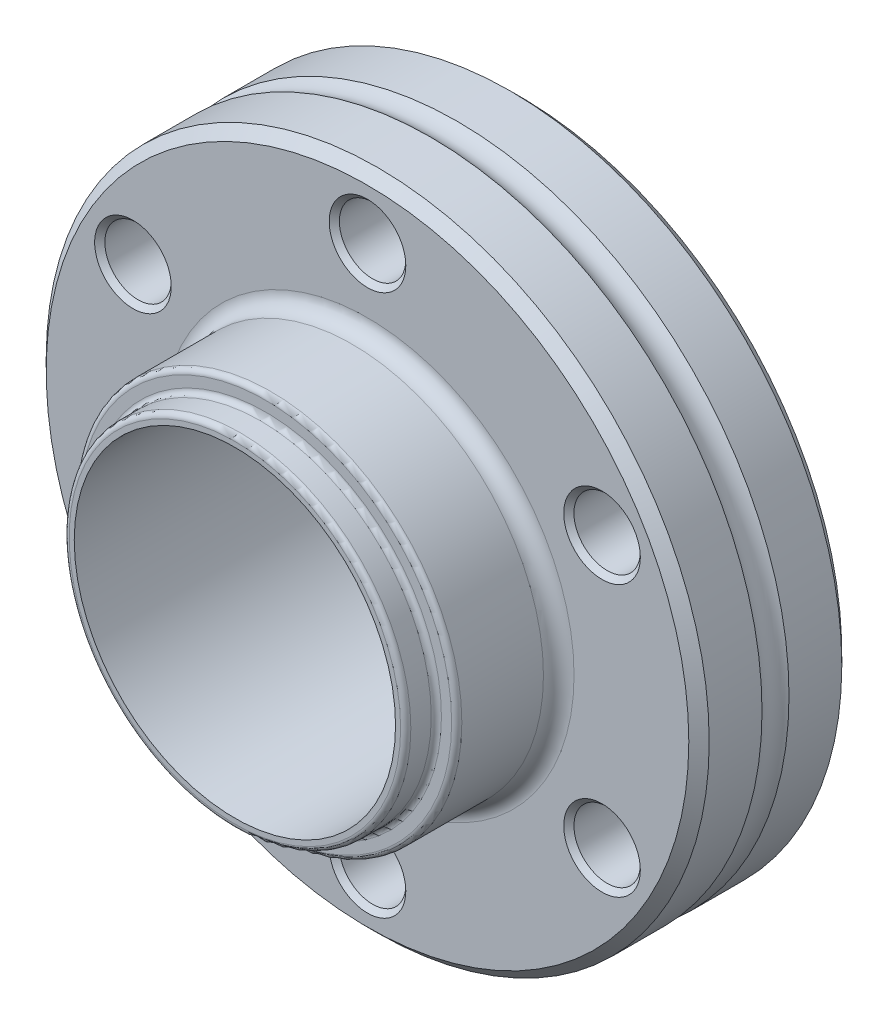
ISO-10303-21;
HEADER;
FILE_DESCRIPTION(('STEP AP214'),'2;1');
FILE_NAME('part.step','',(''),(''),'','','');
FILE_SCHEMA(('AUTOMOTIVE_DESIGN { 1 0 10303 214 1 1 1 1 }'));
ENDSEC;
DATA;
#1=APPLICATION_CONTEXT('core data for automotive mechanical design processes');
#2=APPLICATION_PROTOCOL_DEFINITION('international standard','automotive_design',2000,#1);
#3=PRODUCT_CONTEXT('',#1,'mechanical');
#4=PRODUCT('Part','Part','',(#3));
#5=PRODUCT_RELATED_PRODUCT_CATEGORY('part','',(#4));
#6=PRODUCT_DEFINITION_FORMATION('','',#4);
#7=PRODUCT_DEFINITION_CONTEXT('part definition',#1,'design');
#8=PRODUCT_DEFINITION('design','',#6,#7);
#9=PRODUCT_DEFINITION_SHAPE('','',#8);
#10=(LENGTH_UNIT() NAMED_UNIT(*) SI_UNIT(.MILLI.,.METRE.));
#11=(NAMED_UNIT(*) PLANE_ANGLE_UNIT() SI_UNIT($,.RADIAN.));
#12=(NAMED_UNIT(*) SI_UNIT($,.STERADIAN.) SOLID_ANGLE_UNIT());
#13=UNCERTAINTY_MEASURE_WITH_UNIT(LENGTH_MEASURE(1.E-05),#10,'distance_accuracy_value','');
#14=(GEOMETRIC_REPRESENTATION_CONTEXT(3) GLOBAL_UNCERTAINTY_ASSIGNED_CONTEXT((#13)) GLOBAL_UNIT_ASSIGNED_CONTEXT((#10,
#11,#12)) REPRESENTATION_CONTEXT('',''));
#15=CARTESIAN_POINT('',(0.,0.,0.));
#16=DIRECTION('',(0.,0.,1.));
#17=DIRECTION('',(1.,0.,0.));
#18=AXIS2_PLACEMENT_3D('',#15,#16,#17);
#19=CARTESIAN_POINT('',(0.,0.,-6.4516));
#20=DIRECTION('',(0.,0.,-1.));
#21=DIRECTION('',(-1.,0.,0.));
#22=AXIS2_PLACEMENT_3D('',#19,#20,#21);
#23=CONICAL_SURFACE('',#22,9.271,0.349065850398823);
#24=CARTESIAN_POINT('',(0.,0.,-5.94360000000001));
#25=DIRECTION('',(0.,0.,1.));
#26=DIRECTION('',(1.,0.,0.));
#27=AXIS2_PLACEMENT_3D('',#24,#25,#26);
#28=CIRCLE('',#27,9.0861031209928);
#29=CARTESIAN_POINT('',(9.0861031209928,0.,-5.94360000000001));
#30=VERTEX_POINT('',#29);
#31=EDGE_CURVE('E167',#30,#30,#28,.T.);
#32=ORIENTED_EDGE('',*,*,#31,.T.);
#33=EDGE_LOOP('',(#32));
#34=FACE_BOUND('',#33,.T.);
#35=CARTESIAN_POINT('',(0.,0.,-6.4516));
#36=DIRECTION('',(0.,0.,1.));
#37=DIRECTION('',(1.,0.,0.));
#38=AXIS2_PLACEMENT_3D('',#35,#36,#37);
#39=CIRCLE('',#38,9.271);
#40=CARTESIAN_POINT('',(9.271,0.,-6.4516));
#41=VERTEX_POINT('',#40);
#42=EDGE_CURVE('E152',#41,#41,#39,.T.);
#43=ORIENTED_EDGE('',*,*,#42,.F.);
#44=EDGE_LOOP('',(#43));
#45=FACE_BOUND('',#44,.T.);
#46=ADVANCED_FACE('F30',(#34,#45),#23,.F.);
#47=CARTESIAN_POINT('',(0.,0.,-5.92002147285428));
#48=DIRECTION('',(0.,0.,1.));
#49=DIRECTION('',(1.,0.,0.));
#50=AXIS2_PLACEMENT_3D('',#47,#48,#49);
#51=CONICAL_SURFACE('',#50,10.7315,1.22173047639607);
#52=ORIENTED_EDGE('',*,*,#42,.T.);
#53=EDGE_LOOP('',(#52));
#54=FACE_BOUND('',#53,.T.);
#55=CARTESIAN_POINT('',(0.,0.,-5.92002147285428));
#56=DIRECTION('',(0.,0.,1.));
#57=DIRECTION('',(1.,0.,0.));
#58=AXIS2_PLACEMENT_3D('',#55,#56,#57);
#59=CIRCLE('',#58,10.7315);
#60=CARTESIAN_POINT('',(10.7315,0.,-5.92002147285428));
#61=VERTEX_POINT('',#60);
#62=EDGE_CURVE('E155',#61,#61,#59,.T.);
#63=ORIENTED_EDGE('',*,*,#62,.F.);
#64=EDGE_LOOP('',(#63));
#65=FACE_BOUND('',#64,.T.);
#66=ADVANCED_FACE('F192',(#54,#65),#51,.T.);
#67=CARTESIAN_POINT('',(0.,0.,-7.112));
#68=DIRECTION('',(0.,0.,1.));
#69=DIRECTION('',(1.,0.,0.));
#70=AXIS2_PLACEMENT_3D('',#67,#68,#69);
#71=CYLINDRICAL_SURFACE('',#70,10.7315);
#72=ORIENTED_EDGE('',*,*,#62,.T.);
#73=EDGE_LOOP('',(#72));
#74=FACE_BOUND('',#73,.T.);
#75=CARTESIAN_POINT('',(0.,0.,-7.112));
#76=DIRECTION('',(0.,0.,1.));
#77=DIRECTION('',(1.,0.,0.));
#78=AXIS2_PLACEMENT_3D('',#75,#76,#77);
#79=CIRCLE('',#78,10.7315);
#80=CARTESIAN_POINT('',(10.7315,0.,-7.112));
#81=VERTEX_POINT('',#80);
#82=EDGE_CURVE('E158',#81,#81,#79,.T.);
#83=ORIENTED_EDGE('',*,*,#82,.F.);
#84=EDGE_LOOP('',(#83));
#85=FACE_BOUND('',#84,.T.);
#86=ADVANCED_FACE('F198',(#74,#85),#71,.F.);
#87=CARTESIAN_POINT('',(16.51,0.,-7.112));
#88=DIRECTION('',(0.,0.,-1.));
#89=DIRECTION('',(-1.,0.,0.));
#90=AXIS2_PLACEMENT_3D('',#87,#88,#89);
#91=PLANE('',#90);
#92=CARTESIAN_POINT('',(0.,0.,-7.112));
#93=DIRECTION('',(0.,0.,-1.));
#94=DIRECTION('',(-1.,0.,0.));
#95=AXIS2_PLACEMENT_3D('',#92,#93,#94);
#96=CIRCLE('',#95,16.002);
#97=CARTESIAN_POINT('',(-16.002,0.,-7.112));
#98=VERTEX_POINT('',#97);
#99=EDGE_CURVE('E74',#98,#98,#96,.T.);
#100=ORIENTED_EDGE('',*,*,#99,.T.);
#101=EDGE_LOOP('',(#100));
#102=FACE_BOUND('',#101,.T.);
#103=CARTESIAN_POINT('',(11.6804310310022,-6.74370000000002,-7.11200000000006));
#104=DIRECTION('',(0.,0.,-1.));
#105=DIRECTION('',(-1.,0.,0.));
#106=AXIS2_PLACEMENT_3D('',#103,#104,#105);
#107=CIRCLE('',#106,1.90754000009767);
#108=CARTESIAN_POINT('',(9.77289103090454,-6.74370000000002,-7.11200000000006));
#109=VERTEX_POINT('',#108);
#110=EDGE_CURVE('E134',#109,#109,#107,.F.);
#111=ORIENTED_EDGE('',*,*,#110,.T.);
#112=EDGE_LOOP('',(#111));
#113=FACE_BOUND('',#112,.T.);
#114=CARTESIAN_POINT('',(0.,-13.4874,-7.112));
#115=DIRECTION('',(0.,0.,-1.));
#116=DIRECTION('',(-1.,0.,0.));
#117=AXIS2_PLACEMENT_3D('',#114,#115,#116);
#118=CIRCLE('',#117,1.90754000009767);
#119=CARTESIAN_POINT('',(-1.90754000009767,-13.4874,-7.112));
#120=VERTEX_POINT('',#119);
#121=EDGE_CURVE('E137',#120,#120,#118,.F.);
#122=ORIENTED_EDGE('',*,*,#121,.T.);
#123=EDGE_LOOP('',(#122));
#124=FACE_BOUND('',#123,.T.);
#125=CARTESIAN_POINT('',(11.6804310310022,6.74369999999999,-7.112));
#126=DIRECTION('',(0.,0.,-1.));
#127=DIRECTION('',(-1.,0.,0.));
#128=AXIS2_PLACEMENT_3D('',#125,#126,#127);
#129=CIRCLE('',#128,1.90754000009767);
#130=CARTESIAN_POINT('',(9.77289103090454,6.74369999999999,-7.112));
#131=VERTEX_POINT('',#130);
#132=EDGE_CURVE('E140',#131,#131,#129,.F.);
#133=ORIENTED_EDGE('',*,*,#132,.T.);
#134=EDGE_LOOP('',(#133));
#135=FACE_BOUND('',#134,.T.);
#136=CARTESIAN_POINT('',(-11.6804310310022,-6.7437,-7.112));
#137=DIRECTION('',(0.,0.,-1.));
#138=DIRECTION('',(-1.,0.,0.));
#139=AXIS2_PLACEMENT_3D('',#136,#137,#138);
#140=CIRCLE('',#139,1.90754000009767);
#141=CARTESIAN_POINT('',(-13.5879710310999,-6.7437,-7.112));
#142=VERTEX_POINT('',#141);
#143=EDGE_CURVE('E143',#142,#142,#140,.F.);
#144=ORIENTED_EDGE('',*,*,#143,.T.);
#145=EDGE_LOOP('',(#144));
#146=FACE_BOUND('',#145,.T.);
#147=CARTESIAN_POINT('',(0.,13.4874,-7.112));
#148=DIRECTION('',(0.,0.,-1.));
#149=DIRECTION('',(-1.,0.,0.));
#150=AXIS2_PLACEMENT_3D('',#147,#148,#149);
#151=CIRCLE('',#150,1.90754000009767);
#152=CARTESIAN_POINT('',(-1.90754000009767,13.4874,-7.112));
#153=VERTEX_POINT('',#152);
#154=EDGE_CURVE('E146',#153,#153,#151,.F.);
#155=ORIENTED_EDGE('',*,*,#154,.T.);
#156=EDGE_LOOP('',(#155));
#157=FACE_BOUND('',#156,.T.);
#158=CARTESIAN_POINT('',(-11.6804310310022,6.7437,-7.11199999999994));
#159=DIRECTION('',(0.,0.,-1.));
#160=DIRECTION('',(-1.,0.,0.));
#161=AXIS2_PLACEMENT_3D('',#158,#159,#160);
#162=CIRCLE('',#161,1.90754000009767);
#163=CARTESIAN_POINT('',(-13.5879710310999,6.7437,-7.11199999999994));
#164=VERTEX_POINT('',#163);
#165=EDGE_CURVE('E149',#164,#164,#162,.F.);
#166=ORIENTED_EDGE('',*,*,#165,.T.);
#167=EDGE_LOOP('',(#166));
#168=FACE_BOUND('',#167,.T.);
#169=ORIENTED_EDGE('',*,*,#82,.T.);
#170=EDGE_LOOP('',(#169));
#171=FACE_BOUND('',#170,.T.);
#172=ADVANCED_FACE('F309',(#102,#113,#124,#135,#146,#157,#168,#171),#91,.T.);
#173=CARTESIAN_POINT('',(0.,0.,-7.112));
#174=DIRECTION('',(0.,0.,1.));
#175=DIRECTION('',(1.,0.,0.));
#176=AXIS2_PLACEMENT_3D('',#173,#174,#175);
#177=CYLINDRICAL_SURFACE('',#176,16.51);
#178=CARTESIAN_POINT('',(0.,0.,-6.60399999999999));
#179=DIRECTION('',(0.,0.,-1.));
#180=DIRECTION('',(-1.,0.,0.));
#181=AXIS2_PLACEMENT_3D('',#178,#179,#180);
#182=CIRCLE('',#181,16.51);
#183=CARTESIAN_POINT('',(-16.51,0.,-6.60399999999999));
#184=VERTEX_POINT('',#183);
#185=EDGE_CURVE('E77',#184,#184,#182,.F.);
#186=ORIENTED_EDGE('',*,*,#185,.T.);
#187=EDGE_LOOP('',(#186));
#188=FACE_BOUND('',#187,.T.);
#189=CARTESIAN_POINT('',(0.,0.,-3.97402083301042));
#190=DIRECTION('',(0.,0.,1.));
#191=DIRECTION('',(1.,0.,0.));
#192=AXIS2_PLACEMENT_3D('',#189,#190,#191);
#193=CIRCLE('',#192,16.51);
#194=CARTESIAN_POINT('',(16.51,0.,-3.97402083301042));
#195=VERTEX_POINT('',#194);
#196=EDGE_CURVE('E161',#195,#195,#193,.T.);
#197=ORIENTED_EDGE('',*,*,#196,.F.);
#198=EDGE_LOOP('',(#197));
#199=FACE_BOUND('',#198,.T.);
#200=ADVANCED_FACE('F305',(#188,#199),#177,.T.);
#201=CARTESIAN_POINT('',(0.,0.,-3.302));
#202=DIRECTION('',(0.,0.,1.));
#203=DIRECTION('',(1.,0.,0.));
#204=AXIS2_PLACEMENT_3D('',#201,#202,#203);
#205=TOROIDAL_SURFACE('',#204,17.272,1.016);
#206=ORIENTED_EDGE('',*,*,#196,.T.);
#207=EDGE_LOOP('',(#206));
#208=FACE_BOUND('',#207,.T.);
#209=CARTESIAN_POINT('',(0.,0.,-2.62997916698959));
#210=DIRECTION('',(0.,0.,1.));
#211=DIRECTION('',(1.,0.,0.));
#212=AXIS2_PLACEMENT_3D('',#209,#210,#211);
#213=CIRCLE('',#212,16.51);
#214=CARTESIAN_POINT('',(16.51,0.,-2.62997916698959));
#215=VERTEX_POINT('',#214);
#216=EDGE_CURVE('E164',#215,#215,#213,.T.);
#217=ORIENTED_EDGE('',*,*,#216,.F.);
#218=EDGE_LOOP('',(#217));
#219=FACE_BOUND('',#218,.T.);
#220=ADVANCED_FACE('F301',(#208,#219),#205,.F.);
#221=CARTESIAN_POINT('',(0.,0.,-7.112));
#222=DIRECTION('',(0.,0.,1.));
#223=DIRECTION('',(1.,0.,0.));
#224=AXIS2_PLACEMENT_3D('',#221,#222,#223);
#225=CYLINDRICAL_SURFACE('',#224,16.51);
#226=CARTESIAN_POINT('',(0.,0.,0.));
#227=DIRECTION('',(0.,0.,1.));
#228=DIRECTION('',(1.,0.,0.));
#229=AXIS2_PLACEMENT_3D('',#226,#227,#228);
#230=CIRCLE('',#229,16.51);
#231=CARTESIAN_POINT('',(16.51,0.,0.));
#232=VERTEX_POINT('',#231);
#233=EDGE_CURVE('E68',#232,#232,#230,.F.);
#234=ORIENTED_EDGE('',*,*,#233,.T.);
#235=EDGE_LOOP('',(#234));
#236=FACE_BOUND('',#235,.T.);
#237=ORIENTED_EDGE('',*,*,#216,.T.);
#238=EDGE_LOOP('',(#237));
#239=FACE_BOUND('',#238,.T.);
#240=ADVANCED_FACE('F295',(#236,#239),#225,.T.);
#241=CARTESIAN_POINT('',(0.,0.,0.508000000000002));
#242=DIRECTION('',(0.,0.,1.));
#243=DIRECTION('',(1.,0.,0.));
#244=AXIS2_PLACEMENT_3D('',#241,#242,#243);
#245=PLANE('',#244);
#246=CARTESIAN_POINT('',(0.,0.,0.508000000000002));
#247=DIRECTION('',(0.,0.,1.));
#248=DIRECTION('',(1.,0.,0.));
#249=AXIS2_PLACEMENT_3D('',#246,#247,#248);
#250=CIRCLE('',#249,10.287);
#251=CARTESIAN_POINT('',(10.287,0.,0.508000000000002));
#252=VERTEX_POINT('',#251);
#253=EDGE_CURVE('E10',#252,#252,#250,.F.);
#254=ORIENTED_EDGE('',*,*,#253,.T.);
#255=EDGE_LOOP('',(#254));
#256=FACE_BOUND('',#255,.T.);
#257=CARTESIAN_POINT('',(0.,0.,0.508000000000002));
#258=DIRECTION('',(0.,0.,1.));
#259=DIRECTION('',(1.,0.,0.));
#260=AXIS2_PLACEMENT_3D('',#257,#258,#259);
#261=CIRCLE('',#260,16.002);
#262=CARTESIAN_POINT('',(16.002,0.,0.508000000000002));
#263=VERTEX_POINT('',#262);
#264=EDGE_CURVE('E71',#263,#263,#261,.T.);
#265=ORIENTED_EDGE('',*,*,#264,.T.);
#266=EDGE_LOOP('',(#265));
#267=FACE_BOUND('',#266,.T.);
#268=CARTESIAN_POINT('',(0.,-13.4874,0.508000000000002));
#269=DIRECTION('',(0.,0.,1.));
#270=DIRECTION('',(1.,0.,0.));
#271=AXIS2_PLACEMENT_3D('',#268,#269,#270);
#272=CIRCLE('',#271,1.90754000009768);
#273=CARTESIAN_POINT('',(1.90754000009768,-13.4874,0.508000000000002));
#274=VERTEX_POINT('',#273);
#275=EDGE_CURVE('E104',#274,#274,#272,.F.);
#276=ORIENTED_EDGE('',*,*,#275,.T.);
#277=EDGE_LOOP('',(#276));
#278=FACE_BOUND('',#277,.T.);
#279=CARTESIAN_POINT('',(-11.6804310310022,6.7437,0.508000000000057));
#280=DIRECTION('',(0.,0.,1.));
#281=DIRECTION('',(1.,0.,0.));
#282=AXIS2_PLACEMENT_3D('',#279,#280,#281);
#283=CIRCLE('',#282,1.90754000009767);
#284=CARTESIAN_POINT('',(-9.77289103090455,6.7437,0.508000000000057));
#285=VERTEX_POINT('',#284);
#286=EDGE_CURVE('E107',#285,#285,#283,.F.);
#287=ORIENTED_EDGE('',*,*,#286,.T.);
#288=EDGE_LOOP('',(#287));
#289=FACE_BOUND('',#288,.T.);
#290=CARTESIAN_POINT('',(11.6804310310022,6.74369999999999,0.508000000000002));
#291=DIRECTION('',(0.,0.,1.));
#292=DIRECTION('',(1.,0.,0.));
#293=AXIS2_PLACEMENT_3D('',#290,#291,#292);
#294=CIRCLE('',#293,1.90754000009767);
#295=CARTESIAN_POINT('',(13.5879710310999,6.74369999999999,0.508000000000002));
#296=VERTEX_POINT('',#295);
#297=EDGE_CURVE('E110',#296,#296,#294,.F.);
#298=ORIENTED_EDGE('',*,*,#297,.T.);
#299=EDGE_LOOP('',(#298));
#300=FACE_BOUND('',#299,.T.);
#301=CARTESIAN_POINT('',(0.,13.4874,0.508000000000002));
#302=DIRECTION('',(0.,0.,1.));
#303=DIRECTION('',(1.,0.,0.));
#304=AXIS2_PLACEMENT_3D('',#301,#302,#303);
#305=CIRCLE('',#304,1.90754000009768);
#306=CARTESIAN_POINT('',(1.90754000009768,13.4874,0.508000000000002));
#307=VERTEX_POINT('',#306);
#308=EDGE_CURVE('E113',#307,#307,#305,.F.);
#309=ORIENTED_EDGE('',*,*,#308,.T.);
#310=EDGE_LOOP('',(#309));
#311=FACE_BOUND('',#310,.T.);
#312=CARTESIAN_POINT('',(-11.6804310310022,-6.7437,0.507999999999995));
#313=DIRECTION('',(0.,0.,1.));
#314=DIRECTION('',(1.,0.,0.));
#315=AXIS2_PLACEMENT_3D('',#312,#313,#314);
#316=CIRCLE('',#315,1.90754000009767);
#317=CARTESIAN_POINT('',(-9.77289103090453,-6.7437,0.507999999999995));
#318=VERTEX_POINT('',#317);
#319=EDGE_CURVE('E116',#318,#318,#316,.F.);
#320=ORIENTED_EDGE('',*,*,#319,.T.);
#321=EDGE_LOOP('',(#320));
#322=FACE_BOUND('',#321,.T.);
#323=CARTESIAN_POINT('',(11.6804310310022,-6.7437,0.507999999999939));
#324=DIRECTION('',(0.,0.,1.));
#325=DIRECTION('',(1.,0.,0.));
#326=AXIS2_PLACEMENT_3D('',#323,#324,#325);
#327=CIRCLE('',#326,1.90754000009767);
#328=CARTESIAN_POINT('',(13.5879710310999,-6.7437,0.507999999999939));
#329=VERTEX_POINT('',#328);
#330=EDGE_CURVE('E119',#329,#329,#327,.F.);
#331=ORIENTED_EDGE('',*,*,#330,.T.);
#332=EDGE_LOOP('',(#331));
#333=FACE_BOUND('',#332,.T.);
#334=ADVANCED_FACE('F287',(#256,#267,#278,#289,#300,#311,#322,#333),#245,.T.);
#335=CARTESIAN_POINT('',(9.0861031209928,0.,-5.94360000000001));
#336=DIRECTION('',(0.,0.,-1.));
#337=DIRECTION('',(-1.,0.,0.));
#338=AXIS2_PLACEMENT_3D('',#335,#336,#337);
#339=PLANE('',#338);
#340=CARTESIAN_POINT('',(0.,0.,-5.94360000000001));
#341=DIRECTION('',(0.,0.,-1.));
#342=DIRECTION('',(-1.,0.,0.));
#343=AXIS2_PLACEMENT_3D('',#340,#341,#342);
#344=CIRCLE('',#343,8.25500000000001);
#345=CARTESIAN_POINT('',(-8.25500000000001,0.,-5.94360000000001));
#346=VERTEX_POINT('',#345);
#347=EDGE_CURVE('E41',#346,#346,#344,.F.);
#348=ORIENTED_EDGE('',*,*,#347,.T.);
#349=EDGE_LOOP('',(#348));
#350=FACE_BOUND('',#349,.T.);
#351=ORIENTED_EDGE('',*,*,#31,.F.);
#352=EDGE_LOOP('',(#351));
#353=FACE_BOUND('',#352,.T.);
#354=ADVANCED_FACE('F283',(#350,#353),#339,.T.);
#355=CARTESIAN_POINT('',(0.,0.,5.58800000000001));
#356=DIRECTION('',(0.,0.,-1.));
#357=DIRECTION('',(-1.,0.,0.));
#358=AXIS2_PLACEMENT_3D('',#355,#356,#357);
#359=CYLINDRICAL_SURFACE('',#358,9.52499999999999);
#360=CARTESIAN_POINT('',(0.,0.,1.27));
#361=DIRECTION('',(0.,0.,1.));
#362=DIRECTION('',(1.,0.,0.));
#363=AXIS2_PLACEMENT_3D('',#360,#361,#362);
#364=CIRCLE('',#363,9.52499999999999);
#365=CARTESIAN_POINT('',(9.52499999999999,0.,1.27));
#366=VERTEX_POINT('',#365);
#367=EDGE_CURVE('E37',#366,#366,#364,.T.);
#368=ORIENTED_EDGE('',*,*,#367,.T.);
#369=EDGE_LOOP('',(#368));
#370=FACE_BOUND('',#369,.T.);
#371=CARTESIAN_POINT('',(0.,0.,5.33400000000001));
#372=DIRECTION('',(0.,0.,1.));
#373=DIRECTION('',(1.,0.,0.));
#374=AXIS2_PLACEMENT_3D('',#371,#372,#373);
#375=CIRCLE('',#374,9.52499999999999);
#376=CARTESIAN_POINT('',(9.52499999999999,0.,5.33400000000001));
#377=VERTEX_POINT('',#376);
#378=EDGE_CURVE('E59',#377,#377,#375,.F.);
#379=ORIENTED_EDGE('',*,*,#378,.T.);
#380=EDGE_LOOP('',(#379));
#381=FACE_BOUND('',#380,.T.);
#382=ADVANCED_FACE('F286',(#370,#381),#359,.T.);
#383=CARTESIAN_POINT('',(0.,0.,5.58800000000001));
#384=DIRECTION('',(0.,0.,1.));
#385=DIRECTION('',(1.,0.,0.));
#386=AXIS2_PLACEMENT_3D('',#383,#384,#385);
#387=PLANE('',#386);
#388=CARTESIAN_POINT('',(0.,0.,5.58800000000001));
#389=DIRECTION('',(0.,0.,1.));
#390=DIRECTION('',(1.,0.,0.));
#391=AXIS2_PLACEMENT_3D('',#388,#389,#390);
#392=CIRCLE('',#391,9.27099999999999);
#393=CARTESIAN_POINT('',(9.27099999999999,0.,5.58800000000001));
#394=VERTEX_POINT('',#393);
#395=EDGE_CURVE('E62',#394,#394,#392,.T.);
#396=ORIENTED_EDGE('',*,*,#395,.T.);
#397=EDGE_LOOP('',(#396));
#398=FACE_BOUND('',#397,.T.);
#399=CARTESIAN_POINT('',(0.,0.,5.58800000000001));
#400=DIRECTION('',(0.,0.,1.));
#401=DIRECTION('',(1.,0.,0.));
#402=AXIS2_PLACEMENT_3D('',#399,#400,#401);
#403=CIRCLE('',#402,8.76299999999999);
#404=CARTESIAN_POINT('',(8.76299999999999,0.,5.58800000000001));
#405=VERTEX_POINT('',#404);
#406=EDGE_CURVE('E65',#405,#405,#403,.F.);
#407=ORIENTED_EDGE('',*,*,#406,.T.);
#408=EDGE_LOOP('',(#407));
#409=FACE_BOUND('',#408,.T.);
#410=ADVANCED_FACE('F188',(#398,#409),#387,.T.);
#411=CARTESIAN_POINT('',(0.,0.,7.112));
#412=DIRECTION('',(0.,0.,-1.));
#413=DIRECTION('',(-1.,0.,0.));
#414=AXIS2_PLACEMENT_3D('',#411,#412,#413);
#415=CYLINDRICAL_SURFACE('',#414,8.50899999999999);
#416=CARTESIAN_POINT('',(0.,0.,5.84200000000001));
#417=DIRECTION('',(0.,0.,1.));
#418=DIRECTION('',(1.,0.,0.));
#419=AXIS2_PLACEMENT_3D('',#416,#417,#418);
#420=CIRCLE('',#419,8.50899999999999);
#421=CARTESIAN_POINT('',(8.50899999999999,0.,5.84200000000001));
#422=VERTEX_POINT('',#421);
#423=EDGE_CURVE('E53',#422,#422,#420,.T.);
#424=ORIENTED_EDGE('',*,*,#423,.T.);
#425=EDGE_LOOP('',(#424));
#426=FACE_BOUND('',#425,.T.);
#427=CARTESIAN_POINT('',(0.,0.,6.858));
#428=DIRECTION('',(0.,0.,1.));
#429=DIRECTION('',(1.,0.,0.));
#430=AXIS2_PLACEMENT_3D('',#427,#428,#429);
#431=CIRCLE('',#430,8.50899999999999);
#432=CARTESIAN_POINT('',(8.50899999999999,0.,6.858));
#433=VERTEX_POINT('',#432);
#434=EDGE_CURVE('E56',#433,#433,#431,.F.);
#435=ORIENTED_EDGE('',*,*,#434,.T.);
#436=EDGE_LOOP('',(#435));
#437=FACE_BOUND('',#436,.T.);
#438=ADVANCED_FACE('F178',(#426,#437),#415,.T.);
#439=CARTESIAN_POINT('',(0.,0.,7.112));
#440=DIRECTION('',(0.,0.,1.));
#441=DIRECTION('',(1.,0.,0.));
#442=AXIS2_PLACEMENT_3D('',#439,#440,#441);
#443=PLANE('',#442);
#444=CARTESIAN_POINT('',(0.,0.,7.112));
#445=DIRECTION('',(0.,0.,1.));
#446=DIRECTION('',(1.,0.,0.));
#447=AXIS2_PLACEMENT_3D('',#444,#445,#446);
#448=CIRCLE('',#447,8.25499999999999);
#449=CARTESIAN_POINT('',(8.25499999999999,0.,7.112));
#450=VERTEX_POINT('',#449);
#451=EDGE_CURVE('E50',#450,#450,#448,.T.);
#452=ORIENTED_EDGE('',*,*,#451,.T.);
#453=EDGE_LOOP('',(#452));
#454=FACE_BOUND('',#453,.T.);
#455=CARTESIAN_POINT('',(0.,0.,7.112));
#456=DIRECTION('',(0.,0.,1.));
#457=DIRECTION('',(1.,0.,0.));
#458=AXIS2_PLACEMENT_3D('',#455,#456,#457);
#459=CIRCLE('',#458,8.00100000000001);
#460=CARTESIAN_POINT('',(8.00100000000001,0.,7.112));
#461=VERTEX_POINT('',#460);
#462=EDGE_CURVE('E170',#461,#461,#459,.T.);
#463=ORIENTED_EDGE('',*,*,#462,.F.);
#464=EDGE_LOOP('',(#463));
#465=FACE_BOUND('',#464,.T.);
#466=ADVANCED_FACE('F176',(#454,#465),#443,.T.);
#467=CARTESIAN_POINT('',(0.,0.,7.112));
#468=DIRECTION('',(0.,0.,1.));
#469=DIRECTION('',(1.,0.,0.));
#470=AXIS2_PLACEMENT_3D('',#467,#468,#469);
#471=CYLINDRICAL_SURFACE('',#470,8.00100000000001);
#472=CARTESIAN_POINT('',(0.,0.,-5.68960000000001));
#473=DIRECTION('',(0.,0.,-1.));
#474=DIRECTION('',(-1.,0.,0.));
#475=AXIS2_PLACEMENT_3D('',#472,#473,#474);
#476=CIRCLE('',#475,8.00100000000001);
#477=CARTESIAN_POINT('',(-8.00100000000001,0.,-5.68960000000001));
#478=VERTEX_POINT('',#477);
#479=EDGE_CURVE('E45',#478,#478,#476,.T.);
#480=ORIENTED_EDGE('',*,*,#479,.T.);
#481=EDGE_LOOP('',(#480));
#482=FACE_BOUND('',#481,.T.);
#483=ORIENTED_EDGE('',*,*,#462,.T.);
#484=EDGE_LOOP('',(#483));
#485=FACE_BOUND('',#484,.T.);
#486=ADVANCED_FACE('F174',(#482,#485),#471,.F.);
#487=CARTESIAN_POINT('',(11.6804310310022,-6.7437,0.507999999999939));
#488=DIRECTION('',(0.,0.,1.));
#489=DIRECTION('',(1.,0.,0.));
#490=AXIS2_PLACEMENT_3D('',#487,#488,#489);
#491=CYLINDRICAL_SURFACE('',#490,1.65353999999999);
#492=CARTESIAN_POINT('',(11.6804310310022,-6.74370000000001,-6.85799999990238));
#493=DIRECTION('',(0.,0.,-1.));
#494=DIRECTION('',(-1.,0.,0.));
#495=AXIS2_PLACEMENT_3D('',#492,#493,#494);
#496=CIRCLE('',#495,1.65353999999999);
#497=CARTESIAN_POINT('',(10.0268910310022,-6.74370000000001,-6.85799999990238));
#498=VERTEX_POINT('',#497);
#499=EDGE_CURVE('E128',#498,#498,#496,.T.);
#500=ORIENTED_EDGE('',*,*,#499,.T.);
#501=EDGE_LOOP('',(#500));
#502=FACE_BOUND('',#501,.T.);
#503=CARTESIAN_POINT('',(11.6804310310022,-6.7437,0.253999999902263));
#504=DIRECTION('',(0.,0.,1.));
#505=DIRECTION('',(1.,0.,0.));
#506=AXIS2_PLACEMENT_3D('',#503,#504,#505);
#507=CIRCLE('',#506,1.65353999999999);
#508=CARTESIAN_POINT('',(13.3339710310022,-6.7437,0.253999999902263));
#509=VERTEX_POINT('',#508);
#510=EDGE_CURVE('E131',#509,#509,#507,.T.);
#511=ORIENTED_EDGE('',*,*,#510,.T.);
#512=EDGE_LOOP('',(#511));
#513=FACE_BOUND('',#512,.T.);
#514=ADVANCED_FACE('F185',(#502,#513),#491,.F.);
#515=CARTESIAN_POINT('',(11.6804310310022,6.74369999999999,-7.112));
#516=DIRECTION('',(0.,0.,-1.));
#517=DIRECTION('',(-1.,0.,0.));
#518=AXIS2_PLACEMENT_3D('',#515,#516,#517);
#519=CYLINDRICAL_SURFACE('',#518,1.65353999999999);
#520=CARTESIAN_POINT('',(11.6804310310022,6.74369999999999,0.253999999902318));
#521=DIRECTION('',(0.,0.,1.));
#522=DIRECTION('',(1.,0.,0.));
#523=AXIS2_PLACEMENT_3D('',#520,#521,#522);
#524=CIRCLE('',#523,1.65353999999999);
#525=CARTESIAN_POINT('',(13.3339710310022,6.74369999999999,0.253999999902318));
#526=VERTEX_POINT('',#525);
#527=EDGE_CURVE('E92',#526,#526,#524,.T.);
#528=ORIENTED_EDGE('',*,*,#527,.T.);
#529=EDGE_LOOP('',(#528));
#530=FACE_BOUND('',#529,.T.);
#531=CARTESIAN_POINT('',(11.6804310310022,6.74369999999999,-6.85799999990232));
#532=DIRECTION('',(0.,0.,-1.));
#533=DIRECTION('',(-1.,0.,0.));
#534=AXIS2_PLACEMENT_3D('',#531,#532,#533);
#535=CIRCLE('',#534,1.65353999999999);
#536=CARTESIAN_POINT('',(10.0268910310022,6.74369999999999,-6.85799999990232));
#537=VERTEX_POINT('',#536);
#538=EDGE_CURVE('E95',#537,#537,#535,.T.);
#539=ORIENTED_EDGE('',*,*,#538,.T.);
#540=EDGE_LOOP('',(#539));
#541=FACE_BOUND('',#540,.T.);
#542=ADVANCED_FACE('F387',(#530,#541),#519,.F.);
#543=CARTESIAN_POINT('',(0.,-13.4874,-7.112));
#544=DIRECTION('',(0.,0.,-1.));
#545=DIRECTION('',(-1.,0.,0.));
#546=AXIS2_PLACEMENT_3D('',#543,#544,#545);
#547=CYLINDRICAL_SURFACE('',#546,1.65353999999999);
#548=CARTESIAN_POINT('',(0.,-13.4874,0.253999999902318));
#549=DIRECTION('',(0.,0.,1.));
#550=DIRECTION('',(1.,0.,0.));
#551=AXIS2_PLACEMENT_3D('',#548,#549,#550);
#552=CIRCLE('',#551,1.65353999999999);
#553=CARTESIAN_POINT('',(1.65353999999999,-13.4874,0.253999999902318));
#554=VERTEX_POINT('',#553);
#555=EDGE_CURVE('E122',#554,#554,#552,.T.);
#556=ORIENTED_EDGE('',*,*,#555,.T.);
#557=EDGE_LOOP('',(#556));
#558=FACE_BOUND('',#557,.T.);
#559=CARTESIAN_POINT('',(0.,-13.4874,-6.85799999990232));
#560=DIRECTION('',(0.,0.,-1.));
#561=DIRECTION('',(-1.,0.,0.));
#562=AXIS2_PLACEMENT_3D('',#559,#560,#561);
#563=CIRCLE('',#562,1.65353999999999);
#564=CARTESIAN_POINT('',(-1.65353999999998,-13.4874,-6.85799999990232));
#565=VERTEX_POINT('',#564);
#566=EDGE_CURVE('E125',#565,#565,#563,.T.);
#567=ORIENTED_EDGE('',*,*,#566,.T.);
#568=EDGE_LOOP('',(#567));
#569=FACE_BOUND('',#568,.T.);
#570=ADVANCED_FACE('F397',(#558,#569),#547,.F.);
#571=CARTESIAN_POINT('',(-11.6804310310022,-6.7437,-7.112));
#572=DIRECTION('',(0.,0.,-1.));
#573=DIRECTION('',(-1.,0.,0.));
#574=AXIS2_PLACEMENT_3D('',#571,#572,#573);
#575=CYLINDRICAL_SURFACE('',#574,1.65353999999999);
#576=CARTESIAN_POINT('',(-11.6804310310022,-6.7437,0.253999999902312));
#577=DIRECTION('',(0.,0.,1.));
#578=DIRECTION('',(1.,0.,0.));
#579=AXIS2_PLACEMENT_3D('',#576,#577,#578);
#580=CIRCLE('',#579,1.65353999999999);
#581=CARTESIAN_POINT('',(-10.0268910310022,-6.7437,0.253999999902312));
#582=VERTEX_POINT('',#581);
#583=EDGE_CURVE('E80',#582,#582,#580,.T.);
#584=ORIENTED_EDGE('',*,*,#583,.T.);
#585=EDGE_LOOP('',(#584));
#586=FACE_BOUND('',#585,.T.);
#587=CARTESIAN_POINT('',(-11.6804310310022,-6.7437,-6.85799999990233));
#588=DIRECTION('',(0.,0.,-1.));
#589=DIRECTION('',(-1.,0.,0.));
#590=AXIS2_PLACEMENT_3D('',#587,#588,#589);
#591=CIRCLE('',#590,1.65353999999999);
#592=CARTESIAN_POINT('',(-13.3339710310022,-6.7437,-6.85799999990233));
#593=VERTEX_POINT('',#592);
#594=EDGE_CURVE('E83',#593,#593,#591,.T.);
#595=ORIENTED_EDGE('',*,*,#594,.T.);
#596=EDGE_LOOP('',(#595));
#597=FACE_BOUND('',#596,.T.);
#598=ADVANCED_FACE('F407',(#586,#597),#575,.F.);
#599=CARTESIAN_POINT('',(-11.6804310310022,6.7437,-7.11199999999994));
#600=DIRECTION('',(0.,0.,-1.));
#601=DIRECTION('',(-1.,0.,0.));
#602=AXIS2_PLACEMENT_3D('',#599,#600,#601);
#603=CYLINDRICAL_SURFACE('',#602,1.65353999999999);
#604=CARTESIAN_POINT('',(-11.6804310310022,6.7437,0.253999999902374));
#605=DIRECTION('',(0.,0.,1.));
#606=DIRECTION('',(1.,0.,0.));
#607=AXIS2_PLACEMENT_3D('',#604,#605,#606);
#608=CIRCLE('',#607,1.65353999999999);
#609=CARTESIAN_POINT('',(-10.0268910310022,6.7437,0.253999999902374));
#610=VERTEX_POINT('',#609);
#611=EDGE_CURVE('E98',#610,#610,#608,.T.);
#612=ORIENTED_EDGE('',*,*,#611,.T.);
#613=EDGE_LOOP('',(#612));
#614=FACE_BOUND('',#613,.T.);
#615=CARTESIAN_POINT('',(-11.6804310310022,6.7437,-6.85799999990227));
#616=DIRECTION('',(0.,0.,-1.));
#617=DIRECTION('',(-1.,0.,0.));
#618=AXIS2_PLACEMENT_3D('',#615,#616,#617);
#619=CIRCLE('',#618,1.65353999999999);
#620=CARTESIAN_POINT('',(-13.3339710310022,6.7437,-6.85799999990227));
#621=VERTEX_POINT('',#620);
#622=EDGE_CURVE('E101',#621,#621,#619,.T.);
#623=ORIENTED_EDGE('',*,*,#622,.T.);
#624=EDGE_LOOP('',(#623));
#625=FACE_BOUND('',#624,.T.);
#626=ADVANCED_FACE('F417',(#614,#625),#603,.F.);
#627=CARTESIAN_POINT('',(0.,13.4874,-7.112));
#628=DIRECTION('',(0.,0.,-1.));
#629=DIRECTION('',(-1.,0.,0.));
#630=AXIS2_PLACEMENT_3D('',#627,#628,#629);
#631=CYLINDRICAL_SURFACE('',#630,1.65353999999999);
#632=CARTESIAN_POINT('',(0.,13.4874,0.253999999902318));
#633=DIRECTION('',(0.,0.,1.));
#634=DIRECTION('',(1.,0.,0.));
#635=AXIS2_PLACEMENT_3D('',#632,#633,#634);
#636=CIRCLE('',#635,1.65353999999999);
#637=CARTESIAN_POINT('',(1.65353999999998,13.4874,0.253999999902318));
#638=VERTEX_POINT('',#637);
#639=EDGE_CURVE('E86',#638,#638,#636,.T.);
#640=ORIENTED_EDGE('',*,*,#639,.T.);
#641=EDGE_LOOP('',(#640));
#642=FACE_BOUND('',#641,.T.);
#643=CARTESIAN_POINT('',(0.,13.4874,-6.85799999990232));
#644=DIRECTION('',(0.,0.,-1.));
#645=DIRECTION('',(-1.,0.,0.));
#646=AXIS2_PLACEMENT_3D('',#643,#644,#645);
#647=CIRCLE('',#646,1.65353999999999);
#648=CARTESIAN_POINT('',(-1.65353999999998,13.4874,-6.85799999990232));
#649=VERTEX_POINT('',#648);
#650=EDGE_CURVE('E89',#649,#649,#647,.T.);
#651=ORIENTED_EDGE('',*,*,#650,.T.);
#652=EDGE_LOOP('',(#651));
#653=FACE_BOUND('',#652,.T.);
#654=ADVANCED_FACE('F208',(#642,#653),#631,.F.);
#655=CARTESIAN_POINT('',(11.6804310310022,-6.74370000000002,-7.11200000000006));
#656=DIRECTION('',(0.,0.,-1.));
#657=DIRECTION('',(-1.,0.,0.));
#658=AXIS2_PLACEMENT_3D('',#655,#656,#657);
#659=CONICAL_SURFACE('',#658,1.90754000009767,0.78539816339744);
#660=ORIENTED_EDGE('',*,*,#499,.F.);
#661=EDGE_LOOP('',(#660));
#662=FACE_BOUND('',#661,.T.);
#663=ORIENTED_EDGE('',*,*,#110,.F.);
#664=EDGE_LOOP('',(#663));
#665=FACE_BOUND('',#664,.T.);
#666=ADVANCED_FACE('F204',(#662,#665),#659,.F.);
#667=CARTESIAN_POINT('',(0.,-13.4874,0.253999999902318));
#668=DIRECTION('',(0.,0.,1.));
#669=DIRECTION('',(1.,0.,0.));
#670=AXIS2_PLACEMENT_3D('',#667,#668,#669);
#671=CONICAL_SURFACE('',#670,1.65353999999999,0.785398163397466);
#672=ORIENTED_EDGE('',*,*,#275,.F.);
#673=EDGE_LOOP('',(#672));
#674=FACE_BOUND('',#673,.T.);
#675=ORIENTED_EDGE('',*,*,#555,.F.);
#676=EDGE_LOOP('',(#675));
#677=FACE_BOUND('',#676,.T.);
#678=ADVANCED_FACE('F207',(#674,#677),#671,.F.);
#679=CARTESIAN_POINT('',(-11.6804310310022,6.7437,0.253999999902374));
#680=DIRECTION('',(0.,0.,1.));
#681=DIRECTION('',(1.,0.,0.));
#682=AXIS2_PLACEMENT_3D('',#679,#680,#681);
#683=CONICAL_SURFACE('',#682,1.65353999999999,0.78539816339745);
#684=ORIENTED_EDGE('',*,*,#286,.F.);
#685=EDGE_LOOP('',(#684));
#686=FACE_BOUND('',#685,.T.);
#687=ORIENTED_EDGE('',*,*,#611,.F.);
#688=EDGE_LOOP('',(#687));
#689=FACE_BOUND('',#688,.T.);
#690=ADVANCED_FACE('F212',(#686,#689),#683,.F.);
#691=CARTESIAN_POINT('',(11.6804310310022,6.74369999999999,0.253999999902318));
#692=DIRECTION('',(0.,0.,1.));
#693=DIRECTION('',(1.,0.,0.));
#694=AXIS2_PLACEMENT_3D('',#691,#692,#693);
#695=CONICAL_SURFACE('',#694,1.65353999999999,0.78539816339745);
#696=ORIENTED_EDGE('',*,*,#297,.F.);
#697=EDGE_LOOP('',(#696));
#698=FACE_BOUND('',#697,.T.);
#699=ORIENTED_EDGE('',*,*,#527,.F.);
#700=EDGE_LOOP('',(#699));
#701=FACE_BOUND('',#700,.T.);
#702=ADVANCED_FACE('F216',(#698,#701),#695,.F.);
#703=CARTESIAN_POINT('',(0.,-13.4874,-6.85799999990232));
#704=DIRECTION('',(0.,0.,-1.));
#705=DIRECTION('',(-1.,0.,0.));
#706=AXIS2_PLACEMENT_3D('',#703,#704,#705);
#707=CONICAL_SURFACE('',#706,1.65353999999999,0.785398163397468);
#708=ORIENTED_EDGE('',*,*,#121,.F.);
#709=EDGE_LOOP('',(#708));
#710=FACE_BOUND('',#709,.T.);
#711=ORIENTED_EDGE('',*,*,#566,.F.);
#712=EDGE_LOOP('',(#711));
#713=FACE_BOUND('',#712,.T.);
#714=ADVANCED_FACE('F220',(#710,#713),#707,.F.);
#715=CARTESIAN_POINT('',(11.6804310310022,6.74369999999999,-6.85799999990232));
#716=DIRECTION('',(0.,0.,-1.));
#717=DIRECTION('',(-1.,0.,0.));
#718=AXIS2_PLACEMENT_3D('',#715,#716,#717);
#719=CONICAL_SURFACE('',#718,1.65353999999999,0.785398163397464);
#720=ORIENTED_EDGE('',*,*,#132,.F.);
#721=EDGE_LOOP('',(#720));
#722=FACE_BOUND('',#721,.T.);
#723=ORIENTED_EDGE('',*,*,#538,.F.);
#724=EDGE_LOOP('',(#723));
#725=FACE_BOUND('',#724,.T.);
#726=ADVANCED_FACE('F224',(#722,#725),#719,.F.);
#727=CARTESIAN_POINT('',(0.,13.4874,0.253999999902318));
#728=DIRECTION('',(0.,0.,1.));
#729=DIRECTION('',(1.,0.,0.));
#730=AXIS2_PLACEMENT_3D('',#727,#728,#729);
#731=CONICAL_SURFACE('',#730,1.65353999999999,0.785398163397466);
#732=ORIENTED_EDGE('',*,*,#308,.F.);
#733=EDGE_LOOP('',(#732));
#734=FACE_BOUND('',#733,.T.);
#735=ORIENTED_EDGE('',*,*,#639,.F.);
#736=EDGE_LOOP('',(#735));
#737=FACE_BOUND('',#736,.T.);
#738=ADVANCED_FACE('F228',(#734,#737),#731,.F.);
#739=CARTESIAN_POINT('',(-11.6804310310022,-6.7437,0.253999999902312));
#740=DIRECTION('',(0.,0.,1.));
#741=DIRECTION('',(1.,0.,0.));
#742=AXIS2_PLACEMENT_3D('',#739,#740,#741);
#743=CONICAL_SURFACE('',#742,1.65353999999999,0.78539816339745);
#744=ORIENTED_EDGE('',*,*,#319,.F.);
#745=EDGE_LOOP('',(#744));
#746=FACE_BOUND('',#745,.T.);
#747=ORIENTED_EDGE('',*,*,#583,.F.);
#748=EDGE_LOOP('',(#747));
#749=FACE_BOUND('',#748,.T.);
#750=ADVANCED_FACE('F232',(#746,#749),#743,.F.);
#751=CARTESIAN_POINT('',(11.6804310310022,-6.7437,0.253999999902263));
#752=DIRECTION('',(0.,0.,1.));
#753=DIRECTION('',(1.,0.,0.));
#754=AXIS2_PLACEMENT_3D('',#751,#752,#753);
#755=CONICAL_SURFACE('',#754,1.65353999999999,0.785398163397464);
#756=ORIENTED_EDGE('',*,*,#330,.F.);
#757=EDGE_LOOP('',(#756));
#758=FACE_BOUND('',#757,.T.);
#759=ORIENTED_EDGE('',*,*,#510,.F.);
#760=EDGE_LOOP('',(#759));
#761=FACE_BOUND('',#760,.T.);
#762=ADVANCED_FACE('F236',(#758,#761),#755,.F.);
#763=CARTESIAN_POINT('',(-11.6804310310022,-6.7437,-6.85799999990233));
#764=DIRECTION('',(0.,0.,-1.));
#765=DIRECTION('',(-1.,0.,0.));
#766=AXIS2_PLACEMENT_3D('',#763,#764,#765);
#767=CONICAL_SURFACE('',#766,1.65353999999999,0.785398163397464);
#768=ORIENTED_EDGE('',*,*,#143,.F.);
#769=EDGE_LOOP('',(#768));
#770=FACE_BOUND('',#769,.T.);
#771=ORIENTED_EDGE('',*,*,#594,.F.);
#772=EDGE_LOOP('',(#771));
#773=FACE_BOUND('',#772,.T.);
#774=ADVANCED_FACE('F240',(#770,#773),#767,.F.);
#775=CARTESIAN_POINT('',(0.,13.4874,-6.85799999990232));
#776=DIRECTION('',(0.,0.,-1.));
#777=DIRECTION('',(-1.,0.,0.));
#778=AXIS2_PLACEMENT_3D('',#775,#776,#777);
#779=CONICAL_SURFACE('',#778,1.65353999999999,0.785398163397468);
#780=ORIENTED_EDGE('',*,*,#154,.F.);
#781=EDGE_LOOP('',(#780));
#782=FACE_BOUND('',#781,.T.);
#783=ORIENTED_EDGE('',*,*,#650,.F.);
#784=EDGE_LOOP('',(#783));
#785=FACE_BOUND('',#784,.T.);
#786=ADVANCED_FACE('F244',(#782,#785),#779,.F.);
#787=CARTESIAN_POINT('',(-11.6804310310022,6.7437,-6.85799999990227));
#788=DIRECTION('',(0.,0.,-1.));
#789=DIRECTION('',(-1.,0.,0.));
#790=AXIS2_PLACEMENT_3D('',#787,#788,#789);
#791=CONICAL_SURFACE('',#790,1.65353999999999,0.785398163397464);
#792=ORIENTED_EDGE('',*,*,#165,.F.);
#793=EDGE_LOOP('',(#792));
#794=FACE_BOUND('',#793,.T.);
#795=ORIENTED_EDGE('',*,*,#622,.F.);
#796=EDGE_LOOP('',(#795));
#797=FACE_BOUND('',#796,.T.);
#798=ADVANCED_FACE('F248',(#794,#797),#791,.F.);
#799=CARTESIAN_POINT('',(0.,0.,-6.60399999999999));
#800=DIRECTION('',(0.,0.,1.));
#801=DIRECTION('',(1.,0.,0.));
#802=AXIS2_PLACEMENT_3D('',#799,#800,#801);
#803=CONICAL_SURFACE('',#802,16.51,0.785398163397455);
#804=ORIENTED_EDGE('',*,*,#99,.F.);
#805=EDGE_LOOP('',(#804));
#806=FACE_BOUND('',#805,.T.);
#807=ORIENTED_EDGE('',*,*,#185,.F.);
#808=EDGE_LOOP('',(#807));
#809=FACE_BOUND('',#808,.T.);
#810=ADVANCED_FACE('F252',(#806,#809),#803,.T.);
#811=CARTESIAN_POINT('',(0.,0.,0.508000000000002));
#812=DIRECTION('',(0.,0.,-1.));
#813=DIRECTION('',(-1.,0.,0.));
#814=AXIS2_PLACEMENT_3D('',#811,#812,#813);
#815=CONICAL_SURFACE('',#814,16.002,0.785398163397445);
#816=ORIENTED_EDGE('',*,*,#233,.F.);
#817=EDGE_LOOP('',(#816));
#818=FACE_BOUND('',#817,.T.);
#819=ORIENTED_EDGE('',*,*,#264,.F.);
#820=EDGE_LOOP('',(#819));
#821=FACE_BOUND('',#820,.T.);
#822=ADVANCED_FACE('F256',(#818,#821),#815,.T.);
#823=CARTESIAN_POINT('',(0.,0.,5.33400000000001));
#824=DIRECTION('',(0.,0.,1.));
#825=DIRECTION('',(1.,0.,0.));
#826=AXIS2_PLACEMENT_3D('',#823,#824,#825);
#827=TOROIDAL_SURFACE('',#826,9.27099999999999,0.254);
#828=ORIENTED_EDGE('',*,*,#378,.F.);
#829=EDGE_LOOP('',(#828));
#830=FACE_BOUND('',#829,.T.);
#831=ORIENTED_EDGE('',*,*,#395,.F.);
#832=EDGE_LOOP('',(#831));
#833=FACE_BOUND('',#832,.T.);
#834=ADVANCED_FACE('F260',(#830,#833),#827,.T.);
#835=CARTESIAN_POINT('',(0.,0.,5.84200000000001));
#836=DIRECTION('',(0.,0.,1.));
#837=DIRECTION('',(1.,0.,0.));
#838=AXIS2_PLACEMENT_3D('',#835,#836,#837);
#839=TOROIDAL_SURFACE('',#838,8.76299999999999,0.254);
#840=ORIENTED_EDGE('',*,*,#406,.F.);
#841=EDGE_LOOP('',(#840));
#842=FACE_BOUND('',#841,.T.);
#843=ORIENTED_EDGE('',*,*,#423,.F.);
#844=EDGE_LOOP('',(#843));
#845=FACE_BOUND('',#844,.T.);
#846=ADVANCED_FACE('F264',(#842,#845),#839,.F.);
#847=CARTESIAN_POINT('',(0.,0.,6.858));
#848=DIRECTION('',(0.,0.,1.));
#849=DIRECTION('',(1.,0.,0.));
#850=AXIS2_PLACEMENT_3D('',#847,#848,#849);
#851=TOROIDAL_SURFACE('',#850,8.25499999999999,0.254);
#852=ORIENTED_EDGE('',*,*,#434,.F.);
#853=EDGE_LOOP('',(#852));
#854=FACE_BOUND('',#853,.T.);
#855=ORIENTED_EDGE('',*,*,#451,.F.);
#856=EDGE_LOOP('',(#855));
#857=FACE_BOUND('',#856,.T.);
#858=ADVANCED_FACE('F268',(#854,#857),#851,.T.);
#859=CARTESIAN_POINT('',(0.,0.,-5.68960000000001));
#860=DIRECTION('',(0.,0.,-1.));
#861=DIRECTION('',(-1.,0.,0.));
#862=AXIS2_PLACEMENT_3D('',#859,#860,#861);
#863=TOROIDAL_SURFACE('',#862,8.25500000000001,0.254);
#864=ORIENTED_EDGE('',*,*,#347,.F.);
#865=EDGE_LOOP('',(#864));
#866=FACE_BOUND('',#865,.T.);
#867=ORIENTED_EDGE('',*,*,#479,.F.);
#868=EDGE_LOOP('',(#867));
#869=FACE_BOUND('',#868,.T.);
#870=ADVANCED_FACE('F271',(#866,#869),#863,.T.);
#871=CARTESIAN_POINT('',(0.,0.,1.27));
#872=DIRECTION('',(0.,0.,1.));
#873=DIRECTION('',(1.,0.,0.));
#874=AXIS2_PLACEMENT_3D('',#871,#872,#873);
#875=TOROIDAL_SURFACE('',#874,10.287,0.762);
#876=ORIENTED_EDGE('',*,*,#253,.F.);
#877=EDGE_LOOP('',(#876));
#878=FACE_BOUND('',#877,.T.);
#879=ORIENTED_EDGE('',*,*,#367,.F.);
#880=EDGE_LOOP('',(#879));
#881=FACE_BOUND('',#880,.T.);
#882=ADVANCED_FACE('F32',(#878,#881),#875,.F.);
#883=CLOSED_SHELL('',(#46,#66,#86,#172,#200,#220,#240,#334,#354,#382,#410,#438,#466,#486,#514,
#542,#570,#598,#626,#654,#666,#678,#690,#702,#714,#726,#738,#750,#762,#774,#786,#798,#810,#822,
#834,#846,#858,#870,#882));
#884=MANIFOLD_SOLID_BREP('B2',#883);
#885=ADVANCED_BREP_SHAPE_REPRESENTATION('',(#18,#884),#14);
#886=SHAPE_DEFINITION_REPRESENTATION(#9,#885);
ENDSEC;
END-ISO-10303-21;
